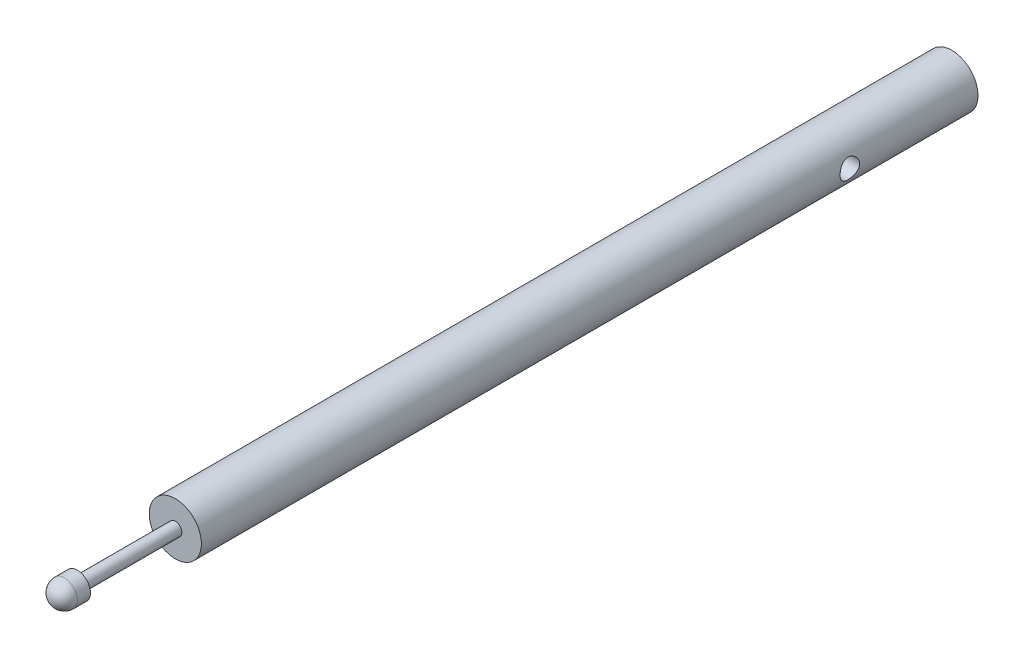
ISO-10303-21;
HEADER;
FILE_DESCRIPTION(('STEP AP214'),'2;1');
FILE_NAME('part.step','',(''),(''),'','','');
FILE_SCHEMA(('AUTOMOTIVE_DESIGN { 1 0 10303 214 1 1 1 1 }'));
ENDSEC;
DATA;
#1=APPLICATION_CONTEXT('core data for automotive mechanical design processes');
#2=APPLICATION_PROTOCOL_DEFINITION('international standard','automotive_design',2000,#1);
#3=PRODUCT_CONTEXT('',#1,'mechanical');
#4=PRODUCT('Part','Part','',(#3));
#5=PRODUCT_RELATED_PRODUCT_CATEGORY('part','',(#4));
#6=PRODUCT_DEFINITION_FORMATION('','',#4);
#7=PRODUCT_DEFINITION_CONTEXT('part definition',#1,'design');
#8=PRODUCT_DEFINITION('design','',#6,#7);
#9=PRODUCT_DEFINITION_SHAPE('','',#8);
#10=(LENGTH_UNIT() NAMED_UNIT(*) SI_UNIT(.MILLI.,.METRE.));
#11=(NAMED_UNIT(*) PLANE_ANGLE_UNIT() SI_UNIT($,.RADIAN.));
#12=(NAMED_UNIT(*) SI_UNIT($,.STERADIAN.) SOLID_ANGLE_UNIT());
#13=UNCERTAINTY_MEASURE_WITH_UNIT(LENGTH_MEASURE(1.E-05),#10,'distance_accuracy_value','');
#14=(GEOMETRIC_REPRESENTATION_CONTEXT(3) GLOBAL_UNCERTAINTY_ASSIGNED_CONTEXT((#13)) GLOBAL_UNIT_ASSIGNED_CONTEXT((#10,
#11,#12)) REPRESENTATION_CONTEXT('',''));
#15=CARTESIAN_POINT('',(0.,0.,0.));
#16=DIRECTION('',(0.,0.,1.));
#17=DIRECTION('',(1.,0.,0.));
#18=AXIS2_PLACEMENT_3D('',#15,#16,#17);
#19=CARTESIAN_POINT('',(0.,0.,119.));
#20=DIRECTION('',(0.,0.,-1.));
#21=DIRECTION('',(-1.,0.,0.));
#22=AXIS2_PLACEMENT_3D('',#19,#20,#21);
#23=CYLINDRICAL_SURFACE('',#22,4.);
#24=CARTESIAN_POINT('',(0.,0.,119.));
#25=DIRECTION('',(0.,0.,1.));
#26=DIRECTION('',(1.,0.,0.));
#27=AXIS2_PLACEMENT_3D('',#24,#25,#26);
#28=CIRCLE('',#27,4.);
#29=CARTESIAN_POINT('',(4.,0.,119.));
#30=VERTEX_POINT('',#29);
#31=EDGE_CURVE('E47',#30,#30,#28,.T.);
#32=ORIENTED_EDGE('',*,*,#31,.F.);
#33=EDGE_LOOP('',(#32));
#34=FACE_BOUND('',#33,.T.);
#35=CARTESIAN_POINT('',(0.,0.,0.));
#36=DIRECTION('',(0.,0.,1.));
#37=DIRECTION('',(1.,0.,0.));
#38=AXIS2_PLACEMENT_3D('',#35,#36,#37);
#39=CIRCLE('',#38,4.);
#40=CARTESIAN_POINT('',(4.,0.,0.));
#41=VERTEX_POINT('',#40);
#42=EDGE_CURVE('E60',#41,#41,#39,.T.);
#43=ORIENTED_EDGE('',*,*,#42,.T.);
#44=EDGE_LOOP('',(#43));
#45=FACE_BOUND('',#44,.T.);
#46=CARTESIAN_POINT('',(4.,0.,21.1358503166208));
#47=CARTESIAN_POINT('',(4.00000217456151,-0.0812350589378528,21.1358532189239));
#48=CARTESIAN_POINT('',(3.99750379283184,-0.162450241781792,21.1292305563724));
#49=CARTESIAN_POINT('',(3.98778696006928,-0.322453452352361,21.1030221213509));
#50=CARTESIAN_POINT('',(3.98056918893993,-0.401241827987616,21.0834382161503));
#51=CARTESIAN_POINT('',(3.96218832391545,-0.554060784990879,21.0320973148491));
#52=CARTESIAN_POINT('',(3.9510328434944,-0.628100224162278,21.000363799799));
#53=CARTESIAN_POINT('',(3.92588767765353,-0.769799310160255,20.925743903605));
#54=CARTESIAN_POINT('',(3.91189723227548,-0.83745723917788,20.8828545310767));
#55=CARTESIAN_POINT('',(3.88186246971217,-0.967346417045826,20.7852377855499));
#56=CARTESIAN_POINT('',(3.86576002583566,-1.02927073015119,20.7301200543614));
#57=CARTESIAN_POINT('',(3.83360220871327,-1.14324421474363,20.610439881962));
#58=CARTESIAN_POINT('',(3.81754685135033,-1.19529036359203,20.5458745605329));
#59=CARTESIAN_POINT('',(3.78662470617731,-1.28998202215985,20.4061328490976));
#60=CARTESIAN_POINT('',(3.77182648820818,-1.3321939319576,20.330645950075));
#61=CARTESIAN_POINT('',(3.74599860237433,-1.40318646334085,20.1730019624523));
#62=CARTESIAN_POINT('',(3.73496742975881,-1.43197244961239,20.0908475534657));
#63=CARTESIAN_POINT('',(3.71854412824136,-1.47408431017549,19.9257335763626));
#64=CARTESIAN_POINT('',(3.71293924350838,-1.48799593218558,19.8429452781854));
#65=CARTESIAN_POINT('',(3.70738061461215,-1.50179556531648,19.676034158627));
#66=CARTESIAN_POINT('',(3.70742453659305,-1.50168936802631,19.5919119027464));
#67=CARTESIAN_POINT('',(3.71297511632055,-1.48790429610018,19.4300807914079));
#68=CARTESIAN_POINT('',(3.71815468871121,-1.47503808509003,19.3522894105766));
#69=CARTESIAN_POINT('',(3.73284938059529,-1.4374416786833,19.2000631662155));
#70=CARTESIAN_POINT('',(3.74236515298863,-1.41270969663258,19.1256288100069));
#71=CARTESIAN_POINT('',(3.76485702190253,-1.35163748571904,18.9805732488926));
#72=CARTESIAN_POINT('',(3.77789517988166,-1.31508648737101,18.9100508304995));
#73=CARTESIAN_POINT('',(3.80594210139319,-1.23156073762698,18.7759045790298));
#74=CARTESIAN_POINT('',(3.82095154457158,-1.18458238728897,18.7122831391011));
#75=CARTESIAN_POINT('',(3.85248038859113,-1.07781780766549,18.5892466529699));
#76=CARTESIAN_POINT('',(3.86903347455671,-1.01738298716956,18.5304016758727));
#77=CARTESIAN_POINT('',(3.90091728164085,-0.887312590819021,18.423512350415));
#78=CARTESIAN_POINT('',(3.91624781465952,-0.817675603497364,18.3754696620152));
#79=CARTESIAN_POINT('',(3.9442639480908,-0.66972343699242,18.2909199195583));
#80=CARTESIAN_POINT('',(3.95690498259616,-0.591290713844719,18.2546027353998));
#81=CARTESIAN_POINT('',(3.97778718326962,-0.428836850524583,18.1958677123508));
#82=CARTESIAN_POINT('',(3.98603030341493,-0.344818210845767,18.1734437000597));
#83=CARTESIAN_POINT('',(3.99684443228065,-0.178375243148666,18.1442275290789));
#84=CARTESIAN_POINT('',(3.99969369025686,-0.0961036195622097,18.1366677102383));
#85=CARTESIAN_POINT('',(4.00025893700126,0.0685724752550241,18.1351592527209));
#86=CARTESIAN_POINT('',(3.99797606386863,0.150976912983373,18.141207596304));
#87=CARTESIAN_POINT('',(3.98871709772643,0.310262048561859,18.1661603589295));
#88=CARTESIAN_POINT('',(3.98192470962305,0.387233328007336,18.1845618603579));
#89=CARTESIAN_POINT('',(3.96451477091717,0.53694175495722,18.2330363891681));
#90=CARTESIAN_POINT('',(3.9538967228203,0.609678350347534,18.2631109345689));
#91=CARTESIAN_POINT('',(3.92949624407681,0.751247765110155,18.3350367290603));
#92=CARTESIAN_POINT('',(3.91563000209348,0.819903083557796,18.3772080458442));
#93=CARTESIAN_POINT('',(3.88626671564664,0.949392711726626,18.4717684197924));
#94=CARTESIAN_POINT('',(3.87076907009516,1.01022412027045,18.524161249166));
#95=CARTESIAN_POINT('',(3.83873329490989,1.12603079874454,18.6412544387451));
#96=CARTESIAN_POINT('',(3.82218696503729,1.18046154123569,18.7064924993935));
#97=CARTESIAN_POINT('',(3.79078815746853,1.27771050031904,18.8455017013285));
#98=CARTESIAN_POINT('',(3.77593583194399,1.32052767414519,18.9192736080093));
#99=CARTESIAN_POINT('',(3.74966829822463,1.39337773518998,19.0738663033931));
#100=CARTESIAN_POINT('',(3.73826760328493,1.42335685446918,19.1547150625313));
#101=CARTESIAN_POINT('',(3.72054032891005,1.46907883466889,19.3208600803087));
#102=CARTESIAN_POINT('',(3.71421061057491,1.48483050305535,19.4061535528189));
#103=CARTESIAN_POINT('',(3.70775894792573,1.50086347097839,19.5728664761619));
#104=CARTESIAN_POINT('',(3.70726444523341,1.50207331495837,19.6541829483377));
#105=CARTESIAN_POINT('',(3.71158412745292,1.49136715641593,19.815795632897));
#106=CARTESIAN_POINT('',(3.71639780898899,1.47945239850124,19.8960919412924));
#107=CARTESIAN_POINT('',(3.73048141585432,1.44355815630242,20.0508975433374));
#108=CARTESIAN_POINT('',(3.73961085376663,1.41995798316524,20.1255086628662));
#109=CARTESIAN_POINT('',(3.76121548297845,1.3616969677992,20.2697558251152));
#110=CARTESIAN_POINT('',(3.77369151995215,1.32703332944945,20.339390604691));
#111=CARTESIAN_POINT('',(3.80139723903965,1.24552075938154,20.4756771063185));
#112=CARTESIAN_POINT('',(3.81673698440964,1.1981283280301,20.5419811134207));
#113=CARTESIAN_POINT('',(3.84806246757177,1.09334485729906,20.665991877592));
#114=CARTESIAN_POINT('',(3.86404840943145,1.03595064012808,20.7236958914076));
#115=CARTESIAN_POINT('',(3.89590424609881,0.909080396784624,20.8320522724427));
#116=CARTESIAN_POINT('',(3.91172104900645,0.839118644212993,20.8821540700555));
#117=CARTESIAN_POINT('',(3.9405451445703,0.691213223200822,20.9698729718974));
#118=CARTESIAN_POINT('',(3.95355221851559,0.613268934090623,21.0074891043572));
#119=CARTESIAN_POINT('',(3.9757429260668,0.447999082002313,21.0702271456692));
#120=CARTESIAN_POINT('',(3.98473657158356,0.360413422234208,21.0947373812227));
#121=CARTESIAN_POINT('',(3.99686242179587,0.181875733606382,21.1275432765415));
#122=CARTESIAN_POINT('',(3.99999756603967,0.0909254163648587,21.1358470681081));
#123=CARTESIAN_POINT('',(4.,0.,21.1358503166208));
#124=B_SPLINE_CURVE_WITH_KNOTS('',3,(#46,#47,#48,#49,#50,#51,#52,#53,#54,#55,#56,#57,#58,#59,
#60,#61,#62,#63,#64,#65,#66,#67,#68,#69,#70,#71,#72,#73,#74,#75,#76,#77,#78,#79,#80,#81,#82,#83,
#84,#85,#86,#87,#88,#89,#90,#91,#92,#93,#94,#95,#96,#97,#98,#99,#100,#101,#102,#103,#104,#105,
#106,#107,#108,#109,#110,#111,#112,#113,#114,#115,#116,#117,#118,#119,#120,#121,#122,#123),
.UNSPECIFIED.,.T.,.F.,(4,2,2,2,2,2,2,2,2,2,2,2,2,2,2,2,2,2,2,2,2,2,2,2,2,2,2,2,2,2,2,2,2,2,2,2,
2,2,4),(0.,0.24336980156056,0.48670454953046,0.729571369213573,0.972503379609492,
1.22473618582716,1.47704604925622,1.73896674501659,2.00078269352134,2.25185874416902,
2.50283106079707,2.73878345119972,2.97477138060589,3.21522408387019,3.45575990744259,
3.71246153335813,3.96920257905066,4.22991375286075,4.49050899698846,4.73725019635926,
4.98393668390521,5.2211443792384,5.45838293254454,5.702592218596,5.94689180019868,
6.20536519455659,6.46386178920141,6.72343066727205,6.98283874956507,7.22558763480252,
7.46831350211259,7.70363142426534,7.93900886656507,8.18672471884271,8.43451941997062,
8.69572329654039,8.95694749805102,9.22948515032042,9.50188601796128),.UNSPECIFIED.);
#125=CARTESIAN_POINT('',(4.,0.,21.1358503166208));
#126=VERTEX_POINT('',#125);
#127=EDGE_CURVE('E42',#126,#126,#124,.T.);
#128=ORIENTED_EDGE('',*,*,#127,.F.);
#129=EDGE_LOOP('',(#128));
#130=FACE_BOUND('',#129,.T.);
#131=CARTESIAN_POINT('',(-4.,0.,18.1358503166208));
#132=CARTESIAN_POINT('',(-4.00000217456151,-0.0812350589378528,18.1358474143177));
#133=CARTESIAN_POINT('',(-3.99750379283184,-0.162450241781792,18.1424700768692));
#134=CARTESIAN_POINT('',(-3.98778696006928,-0.322453452352361,18.1686785118908));
#135=CARTESIAN_POINT('',(-3.98056918893993,-0.401241827987616,18.1882624170914));
#136=CARTESIAN_POINT('',(-3.96218832391545,-0.554060784990879,18.2396033183926));
#137=CARTESIAN_POINT('',(-3.9510328434944,-0.628100224162278,18.2713368334426));
#138=CARTESIAN_POINT('',(-3.92588767765353,-0.769799310160255,18.3459567296366));
#139=CARTESIAN_POINT('',(-3.91189723227548,-0.83745723917788,18.388846102165));
#140=CARTESIAN_POINT('',(-3.88186246971217,-0.967346417045826,18.4864628476917));
#141=CARTESIAN_POINT('',(-3.86576002583566,-1.02927073015119,18.5415805788802));
#142=CARTESIAN_POINT('',(-3.83360220871327,-1.14324421474363,18.6612607512797));
#143=CARTESIAN_POINT('',(-3.81754685135033,-1.19529036359203,18.7258260727087));
#144=CARTESIAN_POINT('',(-3.78662470617731,-1.28998202215985,18.865567784144));
#145=CARTESIAN_POINT('',(-3.77182648820818,-1.3321939319576,18.9410546831666));
#146=CARTESIAN_POINT('',(-3.74599860237433,-1.40318646334085,19.0986986707894));
#147=CARTESIAN_POINT('',(-3.73496742975881,-1.43197244961239,19.1808530797759));
#148=CARTESIAN_POINT('',(-3.71854412824136,-1.47408431017549,19.345967056879));
#149=CARTESIAN_POINT('',(-3.71293924350838,-1.48799593218558,19.4287553550563));
#150=CARTESIAN_POINT('',(-3.70738061461215,-1.50179556531648,19.5956664746147));
#151=CARTESIAN_POINT('',(-3.70742453659305,-1.50168936802631,19.6797887304953));
#152=CARTESIAN_POINT('',(-3.71297511632055,-1.48790429610018,19.8416198418338));
#153=CARTESIAN_POINT('',(-3.71815468871121,-1.47503808509003,19.919411222665));
#154=CARTESIAN_POINT('',(-3.73284938059529,-1.4374416786833,20.0716374670261));
#155=CARTESIAN_POINT('',(-3.74236515298863,-1.41270969663258,20.1460718232347));
#156=CARTESIAN_POINT('',(-3.76485702190253,-1.35163748571904,20.2911273843491));
#157=CARTESIAN_POINT('',(-3.77789517988166,-1.31508648737101,20.3616498027421));
#158=CARTESIAN_POINT('',(-3.80594210139319,-1.23156073762698,20.4957960542118));
#159=CARTESIAN_POINT('',(-3.82095154457158,-1.18458238728897,20.5594174941405));
#160=CARTESIAN_POINT('',(-3.85248038859113,-1.07781780766549,20.6824539802717));
#161=CARTESIAN_POINT('',(-3.86903347455671,-1.01738298716956,20.7412989573689));
#162=CARTESIAN_POINT('',(-3.90091728164085,-0.887312590819021,20.8481882828266));
#163=CARTESIAN_POINT('',(-3.91624781465952,-0.817675603497364,20.8962309712265));
#164=CARTESIAN_POINT('',(-3.9442639480908,-0.66972343699242,20.9807807136833));
#165=CARTESIAN_POINT('',(-3.95690498259616,-0.59129071384472,21.0170978978419));
#166=CARTESIAN_POINT('',(-3.97778718326962,-0.428836850524584,21.0758329208909));
#167=CARTESIAN_POINT('',(-3.98603030341493,-0.344818210845768,21.0982569331819));
#168=CARTESIAN_POINT('',(-3.99684443228065,-0.178375243148666,21.1274731041628));
#169=CARTESIAN_POINT('',(-3.99969369025686,-0.0961036195622097,21.1350329230033));
#170=CARTESIAN_POINT('',(-4.00025893700126,0.0685724752550241,21.1365413805207));
#171=CARTESIAN_POINT('',(-3.99797606386863,0.150976912983373,21.1304930369376));
#172=CARTESIAN_POINT('',(-3.98871709772643,0.310262048561859,21.1055402743122));
#173=CARTESIAN_POINT('',(-3.98192470962305,0.387233328007336,21.0871387728837));
#174=CARTESIAN_POINT('',(-3.96451477091717,0.53694175495722,21.0386642440735));
#175=CARTESIAN_POINT('',(-3.9538967228203,0.609678350347534,21.0085896986728));
#176=CARTESIAN_POINT('',(-3.92949624407681,0.751247765110155,20.9366639041813));
#177=CARTESIAN_POINT('',(-3.91563000209348,0.819903083557796,20.8944925873974));
#178=CARTESIAN_POINT('',(-3.88626671564664,0.949392711726626,20.7999322134493));
#179=CARTESIAN_POINT('',(-3.87076907009516,1.01022412027045,20.7475393840757));
#180=CARTESIAN_POINT('',(-3.83873329490989,1.12603079874454,20.6304461944965));
#181=CARTESIAN_POINT('',(-3.82218696503729,1.18046154123569,20.5652081338481));
#182=CARTESIAN_POINT('',(-3.79078815746854,1.27771050031903,20.4261989319132));
#183=CARTESIAN_POINT('',(-3.77593583194399,1.32052767414519,20.3524270252323));
#184=CARTESIAN_POINT('',(-3.74966829822463,1.39337773518998,20.1978343298485));
#185=CARTESIAN_POINT('',(-3.73826760328493,1.42335685446918,20.1169855707104));
#186=CARTESIAN_POINT('',(-3.72054032891005,1.46907883466889,19.950840552933));
#187=CARTESIAN_POINT('',(-3.71421061057491,1.48483050305535,19.8655470804227));
#188=CARTESIAN_POINT('',(-3.70775894792573,1.50086347097839,19.6988341570797));
#189=CARTESIAN_POINT('',(-3.70726444523341,1.50207331495837,19.6175176849039));
#190=CARTESIAN_POINT('',(-3.71158412745292,1.49136715641593,19.4559050003447));
#191=CARTESIAN_POINT('',(-3.71639780898899,1.47945239850124,19.3756086919492));
#192=CARTESIAN_POINT('',(-3.73048141585432,1.44355815630242,19.2208030899043));
#193=CARTESIAN_POINT('',(-3.73961085376663,1.41995798316524,19.1461919703755));
#194=CARTESIAN_POINT('',(-3.76121548297845,1.3616969677992,19.0019448081264));
#195=CARTESIAN_POINT('',(-3.77369151995215,1.32703332944945,18.9323100285507));
#196=CARTESIAN_POINT('',(-3.80139723903965,1.24552075938154,18.7960235269232));
#197=CARTESIAN_POINT('',(-3.81673698440964,1.1981283280301,18.7297195198209));
#198=CARTESIAN_POINT('',(-3.84806246757177,1.09334485729906,18.6057087556496));
#199=CARTESIAN_POINT('',(-3.86404840943145,1.03595064012808,18.5480047418341));
#200=CARTESIAN_POINT('',(-3.89590424609881,0.909080396784624,18.439648360799));
#201=CARTESIAN_POINT('',(-3.91172104900645,0.839118644212993,18.3895465631862));
#202=CARTESIAN_POINT('',(-3.9405451445703,0.691213223200822,18.3018276613443));
#203=CARTESIAN_POINT('',(-3.95355221851559,0.613268934090623,18.2642115288845));
#204=CARTESIAN_POINT('',(-3.9757429260668,0.447999082002313,18.2014734875725));
#205=CARTESIAN_POINT('',(-3.98473657158356,0.360413422234208,18.1769632520189));
#206=CARTESIAN_POINT('',(-3.99686242179587,0.181875733606382,18.1441573567001));
#207=CARTESIAN_POINT('',(-3.99999756603967,0.0909254163648587,18.1358535651335));
#208=CARTESIAN_POINT('',(-4.,0.,18.1358503166208));
#209=B_SPLINE_CURVE_WITH_KNOTS('',3,(#131,#132,#133,#134,#135,#136,#137,#138,#139,#140,#141,
#142,#143,#144,#145,#146,#147,#148,#149,#150,#151,#152,#153,#154,#155,#156,#157,#158,#159,#160,
#161,#162,#163,#164,#165,#166,#167,#168,#169,#170,#171,#172,#173,#174,#175,#176,#177,#178,#179,
#180,#181,#182,#183,#184,#185,#186,#187,#188,#189,#190,#191,#192,#193,#194,#195,#196,#197,#198,
#199,#200,#201,#202,#203,#204,#205,#206,#207,#208),.UNSPECIFIED.,.T.,.F.,(4,2,2,2,2,2,2,2,2,2,2,
2,2,2,2,2,2,2,2,2,2,2,2,2,2,2,2,2,2,2,2,2,2,2,2,2,2,2,4),(0.,0.24336980156056,0.48670454953046,
0.729571369213573,0.972503379609492,1.22473618582716,1.47704604925622,1.73896674501659,
2.00078269352134,2.25185874416902,2.50283106079707,2.73878345119972,2.97477138060589,
3.21522408387018,3.45575990744259,3.71246153335813,3.96920257905066,4.22991375286075,
4.49050899698846,4.73725019635926,4.98393668390521,5.2211443792384,5.45838293254454,
5.702592218596,5.94689180019868,6.20536519455658,6.46386178920141,6.72343066727204,
6.98283874956507,7.22558763480252,7.4683135021126,7.70363142426534,7.93900886656507,
8.18672471884272,8.43451941997063,8.69572329654039,8.95694749805103,9.22948515032043,
9.50188601796128),.UNSPECIFIED.);
#210=CARTESIAN_POINT('',(-4.,0.,18.1358503166208));
#211=VERTEX_POINT('',#210);
#212=EDGE_CURVE('E52',#211,#211,#209,.T.);
#213=ORIENTED_EDGE('',*,*,#212,.F.);
#214=EDGE_LOOP('',(#213));
#215=FACE_BOUND('',#214,.T.);
#216=ADVANCED_FACE('F31',(#34,#45,#130,#215),#23,.T.);
#217=CARTESIAN_POINT('',(0.,0.,119.));
#218=DIRECTION('',(0.,0.,1.));
#219=DIRECTION('',(1.,0.,0.));
#220=AXIS2_PLACEMENT_3D('',#217,#218,#219);
#221=PLANE('',#220);
#222=CARTESIAN_POINT('',(0.,0.,119.));
#223=DIRECTION('',(0.,0.,1.));
#224=DIRECTION('',(1.,0.,0.));
#225=AXIS2_PLACEMENT_3D('',#222,#223,#224);
#226=CIRCLE('',#225,1.);
#227=CARTESIAN_POINT('',(1.,0.,119.));
#228=VERTEX_POINT('',#227);
#229=EDGE_CURVE('E38',#228,#228,#226,.T.);
#230=ORIENTED_EDGE('',*,*,#229,.F.);
#231=EDGE_LOOP('',(#230));
#232=FACE_BOUND('',#231,.T.);
#233=ORIENTED_EDGE('',*,*,#31,.T.);
#234=EDGE_LOOP('',(#233));
#235=FACE_BOUND('',#234,.T.);
#236=ADVANCED_FACE('F84',(#232,#235),#221,.T.);
#237=CARTESIAN_POINT('',(0.,0.,0.));
#238=DIRECTION('',(0.,0.,1.));
#239=DIRECTION('',(1.,0.,0.));
#240=AXIS2_PLACEMENT_3D('',#237,#238,#239);
#241=PLANE('',#240);
#242=ORIENTED_EDGE('',*,*,#42,.F.);
#243=EDGE_LOOP('',(#242));
#244=FACE_BOUND('',#243,.T.);
#245=ADVANCED_FACE('F89',(#244),#241,.F.);
#246=CARTESIAN_POINT('',(4.,0.,19.6358503166208));
#247=DIRECTION('',(-1.,0.,0.));
#248=DIRECTION('',(0.,0.,1.));
#249=AXIS2_PLACEMENT_3D('',#246,#247,#248);
#250=CYLINDRICAL_SURFACE('',#249,1.5);
#251=ORIENTED_EDGE('',*,*,#212,.T.);
#252=EDGE_LOOP('',(#251));
#253=FACE_BOUND('',#252,.T.);
#254=ORIENTED_EDGE('',*,*,#127,.T.);
#255=EDGE_LOOP('',(#254));
#256=FACE_BOUND('',#255,.T.);
#257=ADVANCED_FACE('F70',(#253,#256),#250,.F.);
#258=CARTESIAN_POINT('',(0.,0.,134.));
#259=DIRECTION('',(0.,0.,-1.));
#260=DIRECTION('',(-1.,0.,0.));
#261=AXIS2_PLACEMENT_3D('',#258,#259,#260);
#262=CYLINDRICAL_SURFACE('',#261,1.);
#263=CARTESIAN_POINT('',(0.,0.,134.));
#264=DIRECTION('',(0.,0.,1.));
#265=DIRECTION('',(1.,0.,0.));
#266=AXIS2_PLACEMENT_3D('',#263,#264,#265);
#267=CIRCLE('',#266,1.);
#268=CARTESIAN_POINT('',(1.,0.,134.));
#269=VERTEX_POINT('',#268);
#270=EDGE_CURVE('E50',#269,#269,#267,.T.);
#271=ORIENTED_EDGE('',*,*,#270,.F.);
#272=EDGE_LOOP('',(#271));
#273=FACE_BOUND('',#272,.T.);
#274=ORIENTED_EDGE('',*,*,#229,.T.);
#275=EDGE_LOOP('',(#274));
#276=FACE_BOUND('',#275,.T.);
#277=ADVANCED_FACE('F66',(#273,#276),#262,.T.);
#278=CARTESIAN_POINT('',(0.,0.,138.));
#279=DIRECTION('',(0.,0.,-1.));
#280=DIRECTION('',(-1.,0.,0.));
#281=AXIS2_PLACEMENT_3D('',#278,#279,#280);
#282=CYLINDRICAL_SURFACE('',#281,2.);
#283=CARTESIAN_POINT('',(0.,0.,136.));
#284=DIRECTION('',(0.,0.,-1.));
#285=DIRECTION('',(-1.,0.,0.));
#286=AXIS2_PLACEMENT_3D('',#283,#284,#285);
#287=CIRCLE('',#286,2.);
#288=CARTESIAN_POINT('',(-2.,0.,136.));
#289=VERTEX_POINT('',#288);
#290=EDGE_CURVE('E10',#289,#289,#287,.T.);
#291=ORIENTED_EDGE('',*,*,#290,.T.);
#292=EDGE_LOOP('',(#291));
#293=FACE_BOUND('',#292,.T.);
#294=CARTESIAN_POINT('',(0.,0.,134.));
#295=DIRECTION('',(0.,0.,1.));
#296=DIRECTION('',(1.,0.,0.));
#297=AXIS2_PLACEMENT_3D('',#294,#295,#296);
#298=CIRCLE('',#297,2.);
#299=CARTESIAN_POINT('',(2.,0.,134.));
#300=VERTEX_POINT('',#299);
#301=EDGE_CURVE('E160',#300,#300,#298,.T.);
#302=ORIENTED_EDGE('',*,*,#301,.T.);
#303=EDGE_LOOP('',(#302));
#304=FACE_BOUND('',#303,.T.);
#305=ADVANCED_FACE('F69',(#293,#304),#282,.T.);
#306=CARTESIAN_POINT('',(0.,0.,134.));
#307=DIRECTION('',(0.,0.,1.));
#308=DIRECTION('',(1.,0.,0.));
#309=AXIS2_PLACEMENT_3D('',#306,#307,#308);
#310=PLANE('',#309);
#311=ORIENTED_EDGE('',*,*,#270,.T.);
#312=EDGE_LOOP('',(#311));
#313=FACE_BOUND('',#312,.T.);
#314=ORIENTED_EDGE('',*,*,#301,.F.);
#315=EDGE_LOOP('',(#314));
#316=FACE_BOUND('',#315,.T.);
#317=ADVANCED_FACE('F74',(#313,#316),#310,.F.);
#318=CARTESIAN_POINT('',(0.,0.,136.));
#319=DIRECTION('',(0.,0.,1.));
#320=DIRECTION('',(1.,0.,0.));
#321=AXIS2_PLACEMENT_3D('',#318,#319,#320);
#322=SPHERICAL_SURFACE('',#321,2.);
#323=ORIENTED_EDGE('',*,*,#290,.F.);
#324=EDGE_LOOP('',(#323));
#325=FACE_BOUND('',#324,.T.);
#326=ADVANCED_FACE('F33',(#325),#322,.T.);
#327=CLOSED_SHELL('',(#216,#236,#245,#257,#277,#305,#317,#326));
#328=MANIFOLD_SOLID_BREP('B2',#327);
#329=ADVANCED_BREP_SHAPE_REPRESENTATION('',(#18,#328),#14);
#330=SHAPE_DEFINITION_REPRESENTATION(#9,#329);
ENDSEC;
END-ISO-10303-21;
